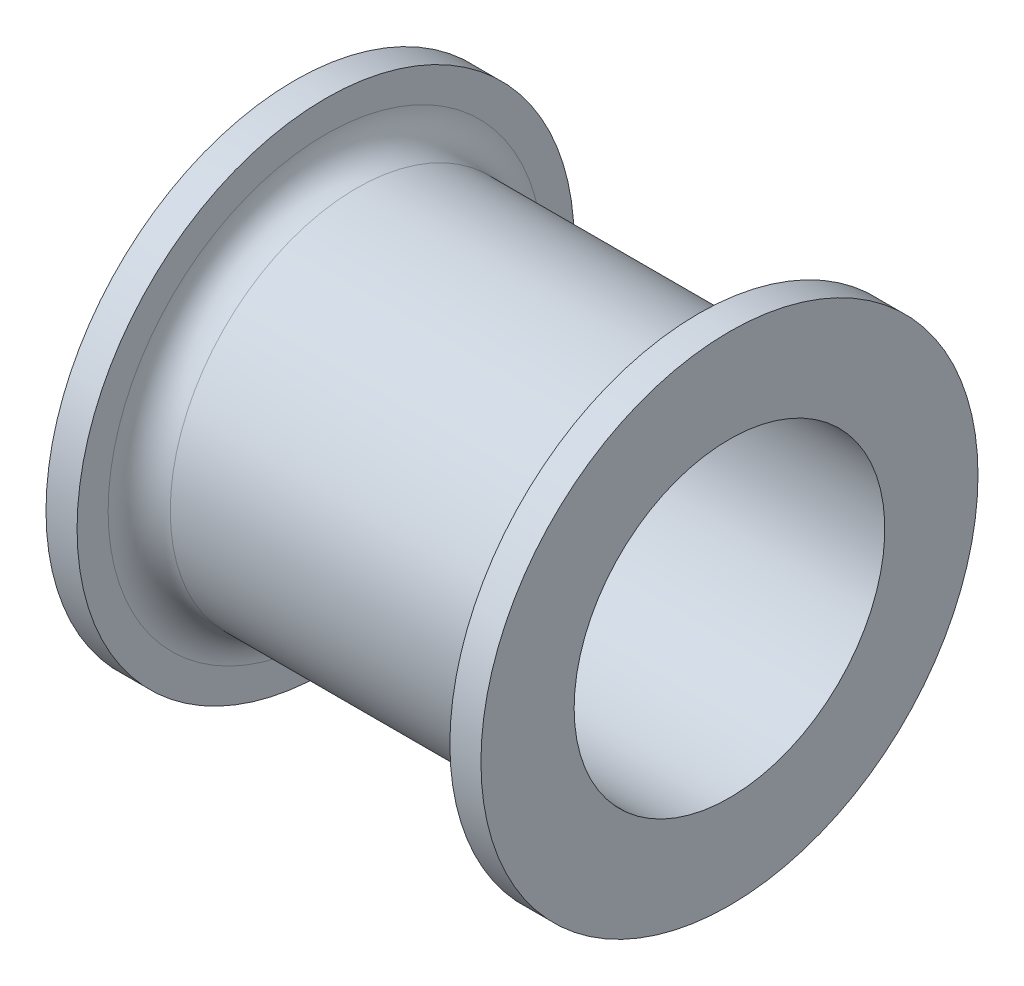
ISO-10303-21;
HEADER;
FILE_DESCRIPTION(('STEP AP214'),'2;1');
FILE_NAME('part.step','',(''),(''),'','','');
FILE_SCHEMA(('AUTOMOTIVE_DESIGN { 1 0 10303 214 1 1 1 1 }'));
ENDSEC;
DATA;
#1=APPLICATION_CONTEXT('core data for automotive mechanical design processes');
#2=APPLICATION_PROTOCOL_DEFINITION('international standard','automotive_design',2000,#1);
#3=PRODUCT_CONTEXT('',#1,'mechanical');
#4=PRODUCT('Part','Part','',(#3));
#5=PRODUCT_RELATED_PRODUCT_CATEGORY('part','',(#4));
#6=PRODUCT_DEFINITION_FORMATION('','',#4);
#7=PRODUCT_DEFINITION_CONTEXT('part definition',#1,'design');
#8=PRODUCT_DEFINITION('design','',#6,#7);
#9=PRODUCT_DEFINITION_SHAPE('','',#8);
#10=(LENGTH_UNIT() NAMED_UNIT(*) SI_UNIT(.MILLI.,.METRE.));
#11=(NAMED_UNIT(*) PLANE_ANGLE_UNIT() SI_UNIT($,.RADIAN.));
#12=(NAMED_UNIT(*) SI_UNIT($,.STERADIAN.) SOLID_ANGLE_UNIT());
#13=UNCERTAINTY_MEASURE_WITH_UNIT(LENGTH_MEASURE(1.E-05),#10,'distance_accuracy_value','');
#14=(GEOMETRIC_REPRESENTATION_CONTEXT(3) GLOBAL_UNCERTAINTY_ASSIGNED_CONTEXT((#13)) GLOBAL_UNIT_ASSIGNED_CONTEXT((#10,
#11,#12)) REPRESENTATION_CONTEXT('',''));
#15=CARTESIAN_POINT('',(0.,0.,0.));
#16=DIRECTION('',(0.,0.,1.));
#17=DIRECTION('',(1.,0.,0.));
#18=AXIS2_PLACEMENT_3D('',#15,#16,#17);
#19=CARTESIAN_POINT('',(0.,0.,0.));
#20=DIRECTION('',(-1.,0.,0.));
#21=DIRECTION('',(0.,0.,1.));
#22=AXIS2_PLACEMENT_3D('',#19,#20,#21);
#23=CYLINDRICAL_SURFACE('',#22,8.);
#24=CARTESIAN_POINT('',(0.,0.,0.));
#25=DIRECTION('',(-1.,0.,0.));
#26=DIRECTION('',(0.,0.,1.));
#27=AXIS2_PLACEMENT_3D('',#24,#25,#26);
#28=CIRCLE('',#27,8.);
#29=CARTESIAN_POINT('',(0.,0.,8.));
#30=VERTEX_POINT('',#29);
#31=EDGE_CURVE('E61',#30,#30,#28,.T.);
#32=ORIENTED_EDGE('',*,*,#31,.F.);
#33=EDGE_LOOP('',(#32));
#34=FACE_BOUND('',#33,.T.);
#35=CARTESIAN_POINT('',(1.,0.,0.));
#36=DIRECTION('',(-1.,0.,0.));
#37=DIRECTION('',(0.,0.,1.));
#38=AXIS2_PLACEMENT_3D('',#35,#36,#37);
#39=CIRCLE('',#38,8.);
#40=CARTESIAN_POINT('',(1.,0.,8.));
#41=VERTEX_POINT('',#40);
#42=EDGE_CURVE('E81',#41,#41,#39,.T.);
#43=ORIENTED_EDGE('',*,*,#42,.T.);
#44=EDGE_LOOP('',(#43));
#45=FACE_BOUND('',#44,.T.);
#46=ADVANCED_FACE('F37',(#34,#45),#23,.T.);
#47=CARTESIAN_POINT('',(0.,0.,-8.));
#48=DIRECTION('',(1.,0.,0.));
#49=DIRECTION('',(0.,0.,-1.));
#50=AXIS2_PLACEMENT_3D('',#47,#48,#49);
#51=PLANE('',#50);
#52=CARTESIAN_POINT('',(0.,0.,0.));
#53=DIRECTION('',(-1.,0.,0.));
#54=DIRECTION('',(0.,0.,1.));
#55=AXIS2_PLACEMENT_3D('',#52,#53,#54);
#56=CIRCLE('',#55,5.);
#57=CARTESIAN_POINT('',(0.,0.,5.));
#58=VERTEX_POINT('',#57);
#59=EDGE_CURVE('E65',#58,#58,#56,.T.);
#60=ORIENTED_EDGE('',*,*,#59,.F.);
#61=EDGE_LOOP('',(#60));
#62=FACE_BOUND('',#61,.T.);
#63=ORIENTED_EDGE('',*,*,#31,.T.);
#64=EDGE_LOOP('',(#63));
#65=FACE_BOUND('',#64,.T.);
#66=ADVANCED_FACE('F101',(#62,#65),#51,.F.);
#67=CARTESIAN_POINT('',(0.,0.,0.));
#68=DIRECTION('',(-1.,0.,0.));
#69=DIRECTION('',(0.,0.,1.));
#70=AXIS2_PLACEMENT_3D('',#67,#68,#69);
#71=CYLINDRICAL_SURFACE('',#70,5.);
#72=CARTESIAN_POINT('',(14.,0.,0.));
#73=DIRECTION('',(-1.,0.,0.));
#74=DIRECTION('',(0.,0.,1.));
#75=AXIS2_PLACEMENT_3D('',#72,#73,#74);
#76=CIRCLE('',#75,5.);
#77=CARTESIAN_POINT('',(14.,0.,5.));
#78=VERTEX_POINT('',#77);
#79=EDGE_CURVE('E69',#78,#78,#76,.T.);
#80=ORIENTED_EDGE('',*,*,#79,.F.);
#81=EDGE_LOOP('',(#80));
#82=FACE_BOUND('',#81,.T.);
#83=ORIENTED_EDGE('',*,*,#59,.T.);
#84=EDGE_LOOP('',(#83));
#85=FACE_BOUND('',#84,.T.);
#86=ADVANCED_FACE('F107',(#82,#85),#71,.F.);
#87=CARTESIAN_POINT('',(14.,0.,-5.));
#88=DIRECTION('',(-1.,0.,0.));
#89=DIRECTION('',(0.,0.,1.));
#90=AXIS2_PLACEMENT_3D('',#87,#88,#89);
#91=PLANE('',#90);
#92=CARTESIAN_POINT('',(14.,0.,0.));
#93=DIRECTION('',(-1.,0.,0.));
#94=DIRECTION('',(0.,0.,1.));
#95=AXIS2_PLACEMENT_3D('',#92,#93,#94);
#96=CIRCLE('',#95,8.);
#97=CARTESIAN_POINT('',(14.,0.,8.));
#98=VERTEX_POINT('',#97);
#99=EDGE_CURVE('E73',#98,#98,#96,.T.);
#100=ORIENTED_EDGE('',*,*,#99,.F.);
#101=EDGE_LOOP('',(#100));
#102=FACE_BOUND('',#101,.T.);
#103=ORIENTED_EDGE('',*,*,#79,.T.);
#104=EDGE_LOOP('',(#103));
#105=FACE_BOUND('',#104,.T.);
#106=ADVANCED_FACE('F114',(#102,#105),#91,.F.);
#107=CARTESIAN_POINT('',(0.,0.,0.));
#108=DIRECTION('',(-1.,0.,0.));
#109=DIRECTION('',(0.,0.,1.));
#110=AXIS2_PLACEMENT_3D('',#107,#108,#109);
#111=CYLINDRICAL_SURFACE('',#110,8.);
#112=CARTESIAN_POINT('',(13.,0.,0.));
#113=DIRECTION('',(-1.,0.,0.));
#114=DIRECTION('',(0.,0.,1.));
#115=AXIS2_PLACEMENT_3D('',#112,#113,#114);
#116=CIRCLE('',#115,8.);
#117=CARTESIAN_POINT('',(13.,0.,8.));
#118=VERTEX_POINT('',#117);
#119=EDGE_CURVE('E77',#118,#118,#116,.T.);
#120=ORIENTED_EDGE('',*,*,#119,.F.);
#121=EDGE_LOOP('',(#120));
#122=FACE_BOUND('',#121,.T.);
#123=ORIENTED_EDGE('',*,*,#99,.T.);
#124=EDGE_LOOP('',(#123));
#125=FACE_BOUND('',#124,.T.);
#126=ADVANCED_FACE('F118',(#122,#125),#111,.T.);
#127=CARTESIAN_POINT('',(13.,0.,-8.));
#128=DIRECTION('',(1.,0.,0.));
#129=DIRECTION('',(0.,0.,-1.));
#130=AXIS2_PLACEMENT_3D('',#127,#128,#129);
#131=PLANE('',#130);
#132=CARTESIAN_POINT('',(13.,0.,0.));
#133=DIRECTION('',(1.,0.,0.));
#134=DIRECTION('',(0.,0.,-1.));
#135=AXIS2_PLACEMENT_3D('',#132,#133,#134);
#136=CIRCLE('',#135,7.);
#137=CARTESIAN_POINT('',(13.,0.,-7.));
#138=VERTEX_POINT('',#137);
#139=EDGE_CURVE('E45',#138,#138,#136,.T.);
#140=ORIENTED_EDGE('',*,*,#139,.T.);
#141=EDGE_LOOP('',(#140));
#142=FACE_BOUND('',#141,.T.);
#143=ORIENTED_EDGE('',*,*,#119,.T.);
#144=EDGE_LOOP('',(#143));
#145=FACE_BOUND('',#144,.T.);
#146=ADVANCED_FACE('F97',(#142,#145),#131,.F.);
#147=CARTESIAN_POINT('',(0.,0.,0.));
#148=DIRECTION('',(-1.,0.,0.));
#149=DIRECTION('',(0.,0.,1.));
#150=AXIS2_PLACEMENT_3D('',#147,#148,#149);
#151=CYLINDRICAL_SURFACE('',#150,6.);
#152=CARTESIAN_POINT('',(12.,0.,0.));
#153=DIRECTION('',(1.,0.,0.));
#154=DIRECTION('',(0.,0.,-1.));
#155=AXIS2_PLACEMENT_3D('',#152,#153,#154);
#156=CIRCLE('',#155,6.);
#157=CARTESIAN_POINT('',(12.,0.,-6.));
#158=VERTEX_POINT('',#157);
#159=EDGE_CURVE('E50',#158,#158,#156,.F.);
#160=ORIENTED_EDGE('',*,*,#159,.T.);
#161=EDGE_LOOP('',(#160));
#162=FACE_BOUND('',#161,.T.);
#163=CARTESIAN_POINT('',(2.,0.,0.));
#164=DIRECTION('',(-1.,0.,0.));
#165=DIRECTION('',(0.,0.,1.));
#166=AXIS2_PLACEMENT_3D('',#163,#164,#165);
#167=CIRCLE('',#166,6.);
#168=CARTESIAN_POINT('',(2.,0.,6.));
#169=VERTEX_POINT('',#168);
#170=EDGE_CURVE('E55',#169,#169,#167,.F.);
#171=ORIENTED_EDGE('',*,*,#170,.T.);
#172=EDGE_LOOP('',(#171));
#173=FACE_BOUND('',#172,.T.);
#174=ADVANCED_FACE('F90',(#162,#173),#151,.T.);
#175=CARTESIAN_POINT('',(1.,0.,-6.));
#176=DIRECTION('',(-1.,0.,0.));
#177=DIRECTION('',(0.,0.,1.));
#178=AXIS2_PLACEMENT_3D('',#175,#176,#177);
#179=PLANE('',#178);
#180=CARTESIAN_POINT('',(1.,0.,0.));
#181=DIRECTION('',(-1.,0.,0.));
#182=DIRECTION('',(0.,0.,1.));
#183=AXIS2_PLACEMENT_3D('',#180,#181,#182);
#184=CIRCLE('',#183,7.);
#185=CARTESIAN_POINT('',(1.,0.,7.));
#186=VERTEX_POINT('',#185);
#187=EDGE_CURVE('E10',#186,#186,#184,.T.);
#188=ORIENTED_EDGE('',*,*,#187,.T.);
#189=EDGE_LOOP('',(#188));
#190=FACE_BOUND('',#189,.T.);
#191=ORIENTED_EDGE('',*,*,#42,.F.);
#192=EDGE_LOOP('',(#191));
#193=FACE_BOUND('',#192,.T.);
#194=ADVANCED_FACE('F87',(#190,#193),#179,.F.);
#195=CARTESIAN_POINT('',(12.,0.,0.));
#196=DIRECTION('',(1.,0.,0.));
#197=DIRECTION('',(0.,0.,-1.));
#198=AXIS2_PLACEMENT_3D('',#195,#196,#197);
#199=TOROIDAL_SURFACE('',#198,7.,1.);
#200=ORIENTED_EDGE('',*,*,#139,.F.);
#201=EDGE_LOOP('',(#200));
#202=FACE_BOUND('',#201,.T.);
#203=ORIENTED_EDGE('',*,*,#159,.F.);
#204=EDGE_LOOP('',(#203));
#205=FACE_BOUND('',#204,.T.);
#206=ADVANCED_FACE('F89',(#202,#205),#199,.F.);
#207=CARTESIAN_POINT('',(2.,0.,0.));
#208=DIRECTION('',(-1.,0.,0.));
#209=DIRECTION('',(0.,0.,1.));
#210=AXIS2_PLACEMENT_3D('',#207,#208,#209);
#211=TOROIDAL_SURFACE('',#210,7.,1.);
#212=ORIENTED_EDGE('',*,*,#170,.F.);
#213=EDGE_LOOP('',(#212));
#214=FACE_BOUND('',#213,.T.);
#215=ORIENTED_EDGE('',*,*,#187,.F.);
#216=EDGE_LOOP('',(#215));
#217=FACE_BOUND('',#216,.T.);
#218=ADVANCED_FACE('F39',(#214,#217),#211,.F.);
#219=CLOSED_SHELL('',(#46,#66,#86,#106,#126,#146,#174,#194,#206,#218));
#220=MANIFOLD_SOLID_BREP('B2',#219);
#221=ADVANCED_BREP_SHAPE_REPRESENTATION('',(#18,#220),#14);
#222=SHAPE_DEFINITION_REPRESENTATION(#9,#221);
ENDSEC;
END-ISO-10303-21;
